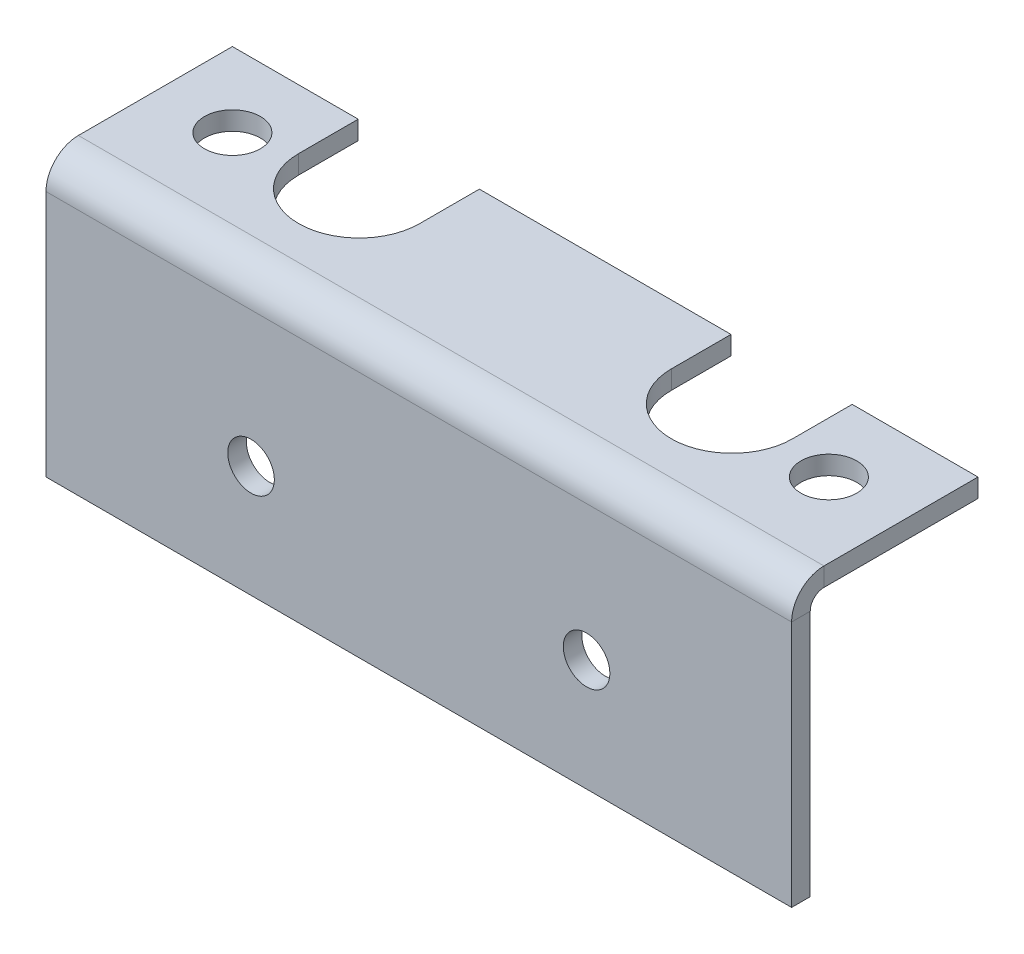
ISO-10303-21;
HEADER;
FILE_DESCRIPTION(('STEP AP214'),'2;1');
FILE_NAME('part.step','',(''),(''),'','','');
FILE_SCHEMA(('AUTOMOTIVE_DESIGN { 1 0 10303 214 1 1 1 1 }'));
ENDSEC;
DATA;
#1=APPLICATION_CONTEXT('core data for automotive mechanical design processes');
#2=APPLICATION_PROTOCOL_DEFINITION('international standard','automotive_design',2000,#1);
#3=PRODUCT_CONTEXT('',#1,'mechanical');
#4=PRODUCT('Part','Part','',(#3));
#5=PRODUCT_RELATED_PRODUCT_CATEGORY('part','',(#4));
#6=PRODUCT_DEFINITION_FORMATION('','',#4);
#7=PRODUCT_DEFINITION_CONTEXT('part definition',#1,'design');
#8=PRODUCT_DEFINITION('design','',#6,#7);
#9=PRODUCT_DEFINITION_SHAPE('','',#8);
#10=(LENGTH_UNIT() NAMED_UNIT(*) SI_UNIT(.MILLI.,.METRE.));
#11=(NAMED_UNIT(*) PLANE_ANGLE_UNIT() SI_UNIT($,.RADIAN.));
#12=(NAMED_UNIT(*) SI_UNIT($,.STERADIAN.) SOLID_ANGLE_UNIT());
#13=UNCERTAINTY_MEASURE_WITH_UNIT(LENGTH_MEASURE(1.E-05),#10,'distance_accuracy_value','');
#14=(GEOMETRIC_REPRESENTATION_CONTEXT(3) GLOBAL_UNCERTAINTY_ASSIGNED_CONTEXT((#13)) GLOBAL_UNIT_ASSIGNED_CONTEXT((#10,
#11,#12)) REPRESENTATION_CONTEXT('',''));
#15=CARTESIAN_POINT('',(0.,0.,0.));
#16=DIRECTION('',(0.,0.,1.));
#17=DIRECTION('',(1.,0.,0.));
#18=AXIS2_PLACEMENT_3D('',#15,#16,#17);
#19=CARTESIAN_POINT('',(0.,7.49999999999999,0.));
#20=DIRECTION('',(0.,-1.,0.));
#21=DIRECTION('',(0.,0.,-1.));
#22=AXIS2_PLACEMENT_3D('',#19,#20,#21);
#23=PLANE('',#22);
#24=CARTESIAN_POINT('',(-16.,7.50000000000008,-6.));
#25=DIRECTION('',(0.,-1.,0.));
#26=DIRECTION('',(0.,0.,-1.));
#27=AXIS2_PLACEMENT_3D('',#24,#25,#26);
#28=CIRCLE('',#27,1.5);
#29=CARTESIAN_POINT('',(-16.,7.50000000000008,-7.5));
#30=VERTEX_POINT('',#29);
#31=EDGE_CURVE('E553',#30,#30,#28,.T.);
#32=ORIENTED_EDGE('',*,*,#31,.T.);
#33=EDGE_LOOP('',(#32));
#34=FACE_BOUND('',#33,.T.);
#35=CARTESIAN_POINT('',(16.,7.50000000000008,-5.99999999999999));
#36=DIRECTION('',(0.,-1.,0.));
#37=DIRECTION('',(0.,0.,-1.));
#38=AXIS2_PLACEMENT_3D('',#35,#36,#37);
#39=CIRCLE('',#38,1.5);
#40=CARTESIAN_POINT('',(16.,7.50000000000008,-7.49999999999999));
#41=VERTEX_POINT('',#40);
#42=EDGE_CURVE('E196',#41,#41,#39,.T.);
#43=ORIENTED_EDGE('',*,*,#42,.T.);
#44=EDGE_LOOP('',(#43));
#45=FACE_BOUND('',#44,.T.);
#46=CARTESIAN_POINT('',(-10.,7.50000000000005,-6.79999999999999));
#47=DIRECTION('',(0.,-1.,0.));
#48=DIRECTION('',(0.,0.,-1.));
#49=AXIS2_PLACEMENT_3D('',#46,#47,#48);
#50=CIRCLE('',#49,3.25);
#51=CARTESIAN_POINT('',(-6.75,7.50000000000005,-6.79999999999999));
#52=VERTEX_POINT('',#51);
#53=CARTESIAN_POINT('',(-13.25,7.50000000000005,-6.79999999999999));
#54=VERTEX_POINT('',#53);
#55=EDGE_CURVE('E180',#52,#54,#50,.T.);
#56=ORIENTED_EDGE('',*,*,#55,.T.);
#57=DIRECTION('',(0.,0.,-1.));
#58=VECTOR('',#57,1.);
#59=CARTESIAN_POINT('',(-13.25,7.50000000000003,0.));
#60=LINE('',#59,#58);
#61=CARTESIAN_POINT('',(-13.25,7.50000000000006,-9.99999999999999));
#62=VERTEX_POINT('',#61);
#63=EDGE_CURVE('E185',#54,#62,#60,.T.);
#64=ORIENTED_EDGE('',*,*,#63,.T.);
#65=DIRECTION('',(-1.,0.,0.));
#66=VECTOR('',#65,1.);
#67=CARTESIAN_POINT('',(0.,7.50000000000003,-9.99999999999999));
#68=LINE('',#67,#66);
#69=CARTESIAN_POINT('',(-20.,7.50000000000003,-9.99999999999999));
#70=VERTEX_POINT('',#69);
#71=EDGE_CURVE('E255',#62,#70,#68,.T.);
#72=ORIENTED_EDGE('',*,*,#71,.T.);
#73=DIRECTION('',(0.,0.,1.));
#74=VECTOR('',#73,1.);
#75=CARTESIAN_POINT('',(-20.,7.49999999999999,0.));
#76=LINE('',#75,#74);
#77=CARTESIAN_POINT('',(-20.,7.5,-1.73659999999999));
#78=VERTEX_POINT('',#77);
#79=EDGE_CURVE('E249',#70,#78,#76,.T.);
#80=ORIENTED_EDGE('',*,*,#79,.T.);
#81=DIRECTION('',(1.,0.,0.));
#82=VECTOR('',#81,1.);
#83=CARTESIAN_POINT('',(-20.,7.5,-1.73659999999999));
#84=LINE('',#83,#82);
#85=CARTESIAN_POINT('',(20.,7.5,-1.7366));
#86=VERTEX_POINT('',#85);
#87=EDGE_CURVE('E268',#86,#78,#84,.F.);
#88=ORIENTED_EDGE('',*,*,#87,.F.);
#89=DIRECTION('',(0.,0.,-1.));
#90=VECTOR('',#89,1.);
#91=CARTESIAN_POINT('',(20.,7.49999999999999,0.));
#92=LINE('',#91,#90);
#93=CARTESIAN_POINT('',(20.,7.50000000000003,-9.99999999999999));
#94=VERTEX_POINT('',#93);
#95=EDGE_CURVE('E256',#86,#94,#92,.T.);
#96=ORIENTED_EDGE('',*,*,#95,.T.);
#97=CARTESIAN_POINT('',(13.25,7.50000000000006,-9.99999999999999));
#98=VERTEX_POINT('',#97);
#99=EDGE_CURVE('E252',#94,#98,#68,.T.);
#100=ORIENTED_EDGE('',*,*,#99,.T.);
#101=DIRECTION('',(0.,0.,-1.));
#102=VECTOR('',#101,1.);
#103=CARTESIAN_POINT('',(13.25,7.50000000000003,0.));
#104=LINE('',#103,#102);
#105=CARTESIAN_POINT('',(13.25,7.50000000000005,-6.8));
#106=VERTEX_POINT('',#105);
#107=EDGE_CURVE('E214',#106,#98,#104,.T.);
#108=ORIENTED_EDGE('',*,*,#107,.F.);
#109=CARTESIAN_POINT('',(10.,7.50000000000005,-6.8));
#110=DIRECTION('',(0.,-1.,0.));
#111=DIRECTION('',(0.,0.,-1.));
#112=AXIS2_PLACEMENT_3D('',#109,#110,#111);
#113=CIRCLE('',#112,3.25);
#114=CARTESIAN_POINT('',(6.75,7.50000000000005,-6.8));
#115=VERTEX_POINT('',#114);
#116=EDGE_CURVE('E209',#115,#106,#113,.F.);
#117=ORIENTED_EDGE('',*,*,#116,.F.);
#118=DIRECTION('',(0.,0.,1.));
#119=VECTOR('',#118,1.);
#120=CARTESIAN_POINT('',(6.75,7.50000000000003,0.));
#121=LINE('',#120,#119);
#122=CARTESIAN_POINT('',(6.74999999999999,7.50000000000006,-9.99999999999999));
#123=VERTEX_POINT('',#122);
#124=EDGE_CURVE('E211',#123,#115,#121,.T.);
#125=ORIENTED_EDGE('',*,*,#124,.F.);
#126=CARTESIAN_POINT('',(-6.75,7.50000000000003,-9.99999999999999));
#127=VERTEX_POINT('',#126);
#128=EDGE_CURVE('E190',#123,#127,#68,.T.);
#129=ORIENTED_EDGE('',*,*,#128,.T.);
#130=DIRECTION('',(0.,0.,1.));
#131=VECTOR('',#130,1.);
#132=CARTESIAN_POINT('',(-6.75,7.50000000000003,0.));
#133=LINE('',#132,#131);
#134=EDGE_CURVE('E73',#127,#52,#133,.T.);
#135=ORIENTED_EDGE('',*,*,#134,.T.);
#136=EDGE_LOOP('',(#56,#64,#72,#80,#88,#96,#100,#108,#117,#125,#129,#135));
#137=FACE_BOUND('',#136,.T.);
#138=ADVANCED_FACE('F58',(#34,#45,#137),#23,.F.);
#139=CARTESIAN_POINT('',(0.,6.49999999999999,0.));
#140=DIRECTION('',(0.,-1.,0.));
#141=DIRECTION('',(0.,0.,-1.));
#142=AXIS2_PLACEMENT_3D('',#139,#140,#141);
#143=PLANE('',#142);
#144=CARTESIAN_POINT('',(-16.,6.50000000000001,-6.));
#145=DIRECTION('',(0.,-1.,0.));
#146=DIRECTION('',(0.,0.,-1.));
#147=AXIS2_PLACEMENT_3D('',#144,#145,#146);
#148=CIRCLE('',#147,1.5);
#149=CARTESIAN_POINT('',(-16.,6.50000000000001,-7.5));
#150=VERTEX_POINT('',#149);
#151=EDGE_CURVE('E556',#150,#150,#148,.T.);
#152=ORIENTED_EDGE('',*,*,#151,.F.);
#153=EDGE_LOOP('',(#152));
#154=FACE_BOUND('',#153,.T.);
#155=CARTESIAN_POINT('',(16.,6.50000000000001,-5.99999999999999));
#156=DIRECTION('',(0.,-1.,0.));
#157=DIRECTION('',(0.,0.,-1.));
#158=AXIS2_PLACEMENT_3D('',#155,#156,#157);
#159=CIRCLE('',#158,1.5);
#160=CARTESIAN_POINT('',(16.,6.50000000000001,-7.49999999999999));
#161=VERTEX_POINT('',#160);
#162=EDGE_CURVE('E558',#161,#161,#159,.T.);
#163=ORIENTED_EDGE('',*,*,#162,.F.);
#164=EDGE_LOOP('',(#163));
#165=FACE_BOUND('',#164,.T.);
#166=DIRECTION('',(0.,0.,-1.));
#167=VECTOR('',#166,1.);
#168=CARTESIAN_POINT('',(-13.25,6.49999999999999,0.));
#169=LINE('',#168,#167);
#170=CARTESIAN_POINT('',(-13.25,6.50000000000002,-6.8));
#171=VERTEX_POINT('',#170);
#172=CARTESIAN_POINT('',(-13.25,6.50000000000003,-10.));
#173=VERTEX_POINT('',#172);
#174=EDGE_CURVE('E191',#171,#173,#169,.T.);
#175=ORIENTED_EDGE('',*,*,#174,.F.);
#176=CARTESIAN_POINT('',(-10.,6.50000000000002,-6.8));
#177=DIRECTION('',(0.,-1.,0.));
#178=DIRECTION('',(0.,0.,-1.));
#179=AXIS2_PLACEMENT_3D('',#176,#177,#178);
#180=CIRCLE('',#179,3.25);
#181=CARTESIAN_POINT('',(-6.75,6.50000000000002,-6.8));
#182=VERTEX_POINT('',#181);
#183=EDGE_CURVE('E193',#182,#171,#180,.T.);
#184=ORIENTED_EDGE('',*,*,#183,.F.);
#185=DIRECTION('',(0.,0.,1.));
#186=VECTOR('',#185,1.);
#187=CARTESIAN_POINT('',(-6.75,6.49999999999999,0.));
#188=LINE('',#187,#186);
#189=CARTESIAN_POINT('',(-6.75,6.50000000000003,-10.));
#190=VERTEX_POINT('',#189);
#191=EDGE_CURVE('E172',#190,#182,#188,.T.);
#192=ORIENTED_EDGE('',*,*,#191,.F.);
#193=DIRECTION('',(1.,0.,0.));
#194=VECTOR('',#193,1.);
#195=CARTESIAN_POINT('',(-20.,6.50000000000003,-10.));
#196=LINE('',#195,#194);
#197=CARTESIAN_POINT('',(6.75,6.50000000000003,-10.));
#198=VERTEX_POINT('',#197);
#199=EDGE_CURVE('E264',#198,#190,#196,.F.);
#200=ORIENTED_EDGE('',*,*,#199,.F.);
#201=DIRECTION('',(0.,0.,1.));
#202=VECTOR('',#201,1.);
#203=CARTESIAN_POINT('',(6.75,6.49999999999999,0.));
#204=LINE('',#203,#202);
#205=CARTESIAN_POINT('',(6.75,6.50000000000002,-6.8));
#206=VERTEX_POINT('',#205);
#207=EDGE_CURVE('E81',#198,#206,#204,.T.);
#208=ORIENTED_EDGE('',*,*,#207,.T.);
#209=CARTESIAN_POINT('',(10.,6.50000000000002,-6.8));
#210=DIRECTION('',(0.,-1.,0.));
#211=DIRECTION('',(0.,0.,-1.));
#212=AXIS2_PLACEMENT_3D('',#209,#210,#211);
#213=CIRCLE('',#212,3.25);
#214=CARTESIAN_POINT('',(13.25,6.50000000000002,-6.80000000000001));
#215=VERTEX_POINT('',#214);
#216=EDGE_CURVE('E217',#206,#215,#213,.F.);
#217=ORIENTED_EDGE('',*,*,#216,.T.);
#218=DIRECTION('',(0.,0.,-1.));
#219=VECTOR('',#218,1.);
#220=CARTESIAN_POINT('',(13.25,6.49999999999999,0.));
#221=LINE('',#220,#219);
#222=CARTESIAN_POINT('',(13.25,6.50000000000003,-10.));
#223=VERTEX_POINT('',#222);
#224=EDGE_CURVE('E212',#215,#223,#221,.T.);
#225=ORIENTED_EDGE('',*,*,#224,.T.);
#226=CARTESIAN_POINT('',(20.,6.50000000000003,-10.));
#227=VERTEX_POINT('',#226);
#228=EDGE_CURVE('E261',#227,#223,#196,.F.);
#229=ORIENTED_EDGE('',*,*,#228,.F.);
#230=DIRECTION('',(0.,0.,1.));
#231=VECTOR('',#230,1.);
#232=CARTESIAN_POINT('',(20.,6.50000000000003,-10.));
#233=LINE('',#232,#231);
#234=CARTESIAN_POINT('',(20.,6.5,-1.7366));
#235=VERTEX_POINT('',#234);
#236=EDGE_CURVE('E266',#235,#227,#233,.F.);
#237=ORIENTED_EDGE('',*,*,#236,.F.);
#238=DIRECTION('',(1.,0.,0.));
#239=VECTOR('',#238,1.);
#240=CARTESIAN_POINT('',(-20.,6.5,-1.7366));
#241=LINE('',#240,#239);
#242=CARTESIAN_POINT('',(-20.,6.5,-1.7366));
#243=VERTEX_POINT('',#242);
#244=EDGE_CURVE('E273',#243,#235,#241,.T.);
#245=ORIENTED_EDGE('',*,*,#244,.F.);
#246=DIRECTION('',(0.,0.,-1.));
#247=VECTOR('',#246,1.);
#248=CARTESIAN_POINT('',(-20.,6.5,-1.));
#249=LINE('',#248,#247);
#250=CARTESIAN_POINT('',(-20.,6.50000000000003,-10.));
#251=VERTEX_POINT('',#250);
#252=EDGE_CURVE('E258',#251,#243,#249,.F.);
#253=ORIENTED_EDGE('',*,*,#252,.F.);
#254=EDGE_CURVE('E265',#173,#251,#196,.F.);
#255=ORIENTED_EDGE('',*,*,#254,.F.);
#256=EDGE_LOOP('',(#175,#184,#192,#200,#208,#217,#225,#229,#237,#245,#253,#255));
#257=FACE_BOUND('',#256,.T.);
#258=ADVANCED_FACE('F339',(#154,#165,#257),#143,.T.);
#259=CARTESIAN_POINT('',(-20.,7.50000000000003,-9.99999999999999));
#260=DIRECTION('',(0.,0.,1.));
#261=DIRECTION('',(0.,-1.,0.));
#262=AXIS2_PLACEMENT_3D('',#259,#260,#261);
#263=PLANE('',#262);
#264=ORIENTED_EDGE('',*,*,#71,.F.);
#265=DIRECTION('',(0.,-1.,0.));
#266=VECTOR('',#265,1.);
#267=CARTESIAN_POINT('',(-13.25,7.50000000000006,-9.99999999999999));
#268=LINE('',#267,#266);
#269=EDGE_CURVE('E203',#62,#173,#268,.T.);
#270=ORIENTED_EDGE('',*,*,#269,.T.);
#271=ORIENTED_EDGE('',*,*,#254,.T.);
#272=DIRECTION('',(0.,-1.,0.));
#273=VECTOR('',#272,1.);
#274=CARTESIAN_POINT('',(-20.,7.50000000000003,-9.99999999999999));
#275=LINE('',#274,#273);
#276=EDGE_CURVE('E246',#70,#251,#275,.T.);
#277=ORIENTED_EDGE('',*,*,#276,.F.);
#278=EDGE_LOOP('',(#264,#270,#271,#277));
#279=FACE_BOUND('',#278,.T.);
#280=ADVANCED_FACE('F348',(#279),#263,.F.);
#281=DIRECTION('',(0.,-1.,0.));
#282=VECTOR('',#281,1.);
#283=CARTESIAN_POINT('',(13.25,7.50000000000006,-9.99999999999999));
#284=LINE('',#283,#282);
#285=EDGE_CURVE('E225',#98,#223,#284,.T.);
#286=ORIENTED_EDGE('',*,*,#285,.F.);
#287=ORIENTED_EDGE('',*,*,#99,.F.);
#288=DIRECTION('',(0.,-1.,0.));
#289=VECTOR('',#288,1.);
#290=CARTESIAN_POINT('',(20.,7.50000000000003,-9.99999999999999));
#291=LINE('',#290,#289);
#292=EDGE_CURVE('E242',#94,#227,#291,.T.);
#293=ORIENTED_EDGE('',*,*,#292,.T.);
#294=ORIENTED_EDGE('',*,*,#228,.T.);
#295=EDGE_LOOP('',(#286,#287,#293,#294));
#296=FACE_BOUND('',#295,.T.);
#297=ADVANCED_FACE('F365',(#296),#263,.F.);
#298=ORIENTED_EDGE('',*,*,#199,.T.);
#299=DIRECTION('',(0.,-1.,0.));
#300=VECTOR('',#299,1.);
#301=CARTESIAN_POINT('',(-6.75,7.50000000000006,-9.99999999999999));
#302=LINE('',#301,#300);
#303=EDGE_CURVE('E177',#127,#190,#302,.T.);
#304=ORIENTED_EDGE('',*,*,#303,.F.);
#305=ORIENTED_EDGE('',*,*,#128,.F.);
#306=DIRECTION('',(0.,-1.,0.));
#307=VECTOR('',#306,1.);
#308=CARTESIAN_POINT('',(6.74999999999999,7.50000000000006,-9.99999999999999));
#309=LINE('',#308,#307);
#310=EDGE_CURVE('E227',#123,#198,#309,.T.);
#311=ORIENTED_EDGE('',*,*,#310,.T.);
#312=EDGE_LOOP('',(#298,#304,#305,#311));
#313=FACE_BOUND('',#312,.T.);
#314=ADVANCED_FACE('F352',(#313),#263,.F.);
#315=CARTESIAN_POINT('',(20.,-7.5,-1.));
#316=DIRECTION('',(1.,0.,0.));
#317=DIRECTION('',(0.,0.,-1.));
#318=AXIS2_PLACEMENT_3D('',#315,#316,#317);
#319=PLANE('',#318);
#320=DIRECTION('',(0.,1.,0.));
#321=VECTOR('',#320,1.);
#322=CARTESIAN_POINT('',(20.,-7.5,-1.));
#323=LINE('',#322,#321);
#324=CARTESIAN_POINT('',(20.,-7.5,-1.));
#325=VERTEX_POINT('',#324);
#326=CARTESIAN_POINT('',(20.,5.7634,-1.));
#327=VERTEX_POINT('',#326);
#328=EDGE_CURVE('E299',#325,#327,#323,.T.);
#329=ORIENTED_EDGE('',*,*,#328,.T.);
#330=DIRECTION('',(0.,0.,1.));
#331=VECTOR('',#330,1.);
#332=CARTESIAN_POINT('',(20.,5.7634,-1.));
#333=LINE('',#332,#331);
#334=CARTESIAN_POINT('',(20.,5.7634,0.));
#335=VERTEX_POINT('',#334);
#336=EDGE_CURVE('E283',#327,#335,#333,.T.);
#337=ORIENTED_EDGE('',*,*,#336,.T.);
#338=DIRECTION('',(0.,1.,0.));
#339=VECTOR('',#338,1.);
#340=CARTESIAN_POINT('',(20.,-7.5,0.));
#341=LINE('',#340,#339);
#342=CARTESIAN_POINT('',(20.,-7.5,0.));
#343=VERTEX_POINT('',#342);
#344=EDGE_CURVE('E297',#343,#335,#341,.T.);
#345=ORIENTED_EDGE('',*,*,#344,.F.);
#346=DIRECTION('',(0.,0.,1.));
#347=VECTOR('',#346,1.);
#348=CARTESIAN_POINT('',(20.,-7.5,-1.));
#349=LINE('',#348,#347);
#350=EDGE_CURVE('E13',#325,#343,#349,.T.);
#351=ORIENTED_EDGE('',*,*,#350,.F.);
#352=EDGE_LOOP('',(#329,#337,#345,#351));
#353=FACE_BOUND('',#352,.T.);
#354=ADVANCED_FACE('F60',(#353),#319,.T.);
#355=CARTESIAN_POINT('',(0.,0.,-1.));
#356=DIRECTION('',(0.,0.,-1.));
#357=DIRECTION('',(-1.,0.,0.));
#358=AXIS2_PLACEMENT_3D('',#355,#356,#357);
#359=PLANE('',#358);
#360=CARTESIAN_POINT('',(-9.,-1.5,-1.));
#361=DIRECTION('',(0.,0.,-1.));
#362=DIRECTION('',(-1.,0.,0.));
#363=AXIS2_PLACEMENT_3D('',#360,#361,#362);
#364=CIRCLE('',#363,1.24999999999999);
#365=CARTESIAN_POINT('',(-10.25,-1.5,-1.));
#366=VERTEX_POINT('',#365);
#367=EDGE_CURVE('E232',#366,#366,#364,.T.);
#368=ORIENTED_EDGE('',*,*,#367,.F.);
#369=EDGE_LOOP('',(#368));
#370=FACE_BOUND('',#369,.T.);
#371=CARTESIAN_POINT('',(9.,-1.5,-1.));
#372=DIRECTION('',(0.,0.,-1.));
#373=DIRECTION('',(-1.,0.,0.));
#374=AXIS2_PLACEMENT_3D('',#371,#372,#373);
#375=CIRCLE('',#374,1.24999999999999);
#376=CARTESIAN_POINT('',(7.75000000000001,-1.5,-1.));
#377=VERTEX_POINT('',#376);
#378=EDGE_CURVE('E238',#377,#377,#375,.T.);
#379=ORIENTED_EDGE('',*,*,#378,.F.);
#380=EDGE_LOOP('',(#379));
#381=FACE_BOUND('',#380,.T.);
#382=DIRECTION('',(0.,-1.,0.));
#383=VECTOR('',#382,1.);
#384=CARTESIAN_POINT('',(-20.,-7.5,-1.));
#385=LINE('',#384,#383);
#386=CARTESIAN_POINT('',(-20.,5.7634,-1.));
#387=VERTEX_POINT('',#386);
#388=CARTESIAN_POINT('',(-20.,-7.5,-1.));
#389=VERTEX_POINT('',#388);
#390=EDGE_CURVE('E302',#387,#389,#385,.T.);
#391=ORIENTED_EDGE('',*,*,#390,.F.);
#392=DIRECTION('',(1.,0.,0.));
#393=VECTOR('',#392,1.);
#394=CARTESIAN_POINT('',(20.,5.7634,-1.));
#395=LINE('',#394,#393);
#396=EDGE_CURVE('E289',#327,#387,#395,.F.);
#397=ORIENTED_EDGE('',*,*,#396,.F.);
#398=ORIENTED_EDGE('',*,*,#328,.F.);
#399=DIRECTION('',(1.,0.,0.));
#400=VECTOR('',#399,1.);
#401=CARTESIAN_POINT('',(-20.,-7.5,-1.));
#402=LINE('',#401,#400);
#403=EDGE_CURVE('E305',#389,#325,#402,.T.);
#404=ORIENTED_EDGE('',*,*,#403,.F.);
#405=EDGE_LOOP('',(#391,#397,#398,#404));
#406=FACE_BOUND('',#405,.T.);
#407=ADVANCED_FACE('F417',(#370,#381,#406),#359,.T.);
#408=CARTESIAN_POINT('',(0.,0.,0.));
#409=DIRECTION('',(0.,0.,-1.));
#410=DIRECTION('',(-1.,0.,0.));
#411=AXIS2_PLACEMENT_3D('',#408,#409,#410);
#412=PLANE('',#411);
#413=CARTESIAN_POINT('',(-9.,-1.5,0.));
#414=DIRECTION('',(0.,0.,1.));
#415=DIRECTION('',(1.,0.,0.));
#416=AXIS2_PLACEMENT_3D('',#413,#414,#415);
#417=CIRCLE('',#416,1.24999999999999);
#418=CARTESIAN_POINT('',(-7.75000000000001,-1.5,0.));
#419=VERTEX_POINT('',#418);
#420=EDGE_CURVE('E206',#419,#419,#417,.T.);
#421=ORIENTED_EDGE('',*,*,#420,.F.);
#422=EDGE_LOOP('',(#421));
#423=FACE_BOUND('',#422,.T.);
#424=CARTESIAN_POINT('',(9.,-1.5,0.));
#425=DIRECTION('',(0.,0.,1.));
#426=DIRECTION('',(1.,0.,0.));
#427=AXIS2_PLACEMENT_3D('',#424,#425,#426);
#428=CIRCLE('',#427,1.24999999999999);
#429=CARTESIAN_POINT('',(10.25,-1.5,0.));
#430=VERTEX_POINT('',#429);
#431=EDGE_CURVE('E235',#430,#430,#428,.T.);
#432=ORIENTED_EDGE('',*,*,#431,.F.);
#433=EDGE_LOOP('',(#432));
#434=FACE_BOUND('',#433,.T.);
#435=DIRECTION('',(1.,0.,0.));
#436=VECTOR('',#435,1.);
#437=CARTESIAN_POINT('',(20.,5.7634,0.));
#438=LINE('',#437,#436);
#439=CARTESIAN_POINT('',(-20.,5.7634,0.));
#440=VERTEX_POINT('',#439);
#441=EDGE_CURVE('E277',#335,#440,#438,.F.);
#442=ORIENTED_EDGE('',*,*,#441,.T.);
#443=DIRECTION('',(0.,-1.,0.));
#444=VECTOR('',#443,1.);
#445=CARTESIAN_POINT('',(-20.,-7.5,0.));
#446=LINE('',#445,#444);
#447=CARTESIAN_POINT('',(-20.,-7.5,0.));
#448=VERTEX_POINT('',#447);
#449=EDGE_CURVE('E310',#440,#448,#446,.T.);
#450=ORIENTED_EDGE('',*,*,#449,.T.);
#451=DIRECTION('',(1.,0.,0.));
#452=VECTOR('',#451,1.);
#453=CARTESIAN_POINT('',(-20.,-7.5,0.));
#454=LINE('',#453,#452);
#455=EDGE_CURVE('E303',#448,#343,#454,.T.);
#456=ORIENTED_EDGE('',*,*,#455,.T.);
#457=ORIENTED_EDGE('',*,*,#344,.T.);
#458=EDGE_LOOP('',(#442,#450,#456,#457));
#459=FACE_BOUND('',#458,.T.);
#460=ADVANCED_FACE('F315',(#423,#434,#459),#412,.F.);
#461=CARTESIAN_POINT('',(-20.,-7.5,-1.));
#462=DIRECTION('',(0.,-1.,0.));
#463=DIRECTION('',(0.,0.,-1.));
#464=AXIS2_PLACEMENT_3D('',#461,#462,#463);
#465=PLANE('',#464);
#466=ORIENTED_EDGE('',*,*,#455,.F.);
#467=DIRECTION('',(0.,0.,1.));
#468=VECTOR('',#467,1.);
#469=CARTESIAN_POINT('',(-20.,-7.5,-1.));
#470=LINE('',#469,#468);
#471=EDGE_CURVE('E62',#389,#448,#470,.T.);
#472=ORIENTED_EDGE('',*,*,#471,.F.);
#473=ORIENTED_EDGE('',*,*,#403,.T.);
#474=ORIENTED_EDGE('',*,*,#350,.T.);
#475=EDGE_LOOP('',(#466,#472,#473,#474));
#476=FACE_BOUND('',#475,.T.);
#477=ADVANCED_FACE('F322',(#476),#465,.T.);
#478=CARTESIAN_POINT('',(-20.,-7.5,-1.));
#479=DIRECTION('',(-1.,0.,0.));
#480=DIRECTION('',(0.,0.,1.));
#481=AXIS2_PLACEMENT_3D('',#478,#479,#480);
#482=PLANE('',#481);
#483=DIRECTION('',(0.,0.,1.));
#484=VECTOR('',#483,1.);
#485=CARTESIAN_POINT('',(-20.,5.7634,-0.999999999999999));
#486=LINE('',#485,#484);
#487=EDGE_CURVE('E294',#387,#440,#486,.T.);
#488=ORIENTED_EDGE('',*,*,#487,.F.);
#489=ORIENTED_EDGE('',*,*,#390,.T.);
#490=ORIENTED_EDGE('',*,*,#471,.T.);
#491=ORIENTED_EDGE('',*,*,#449,.F.);
#492=EDGE_LOOP('',(#488,#489,#490,#491));
#493=FACE_BOUND('',#492,.T.);
#494=ADVANCED_FACE('F413',(#493),#482,.T.);
#495=CARTESIAN_POINT('',(-20.,5.7634,-1.7366));
#496=DIRECTION('',(-1.,0.,0.));
#497=DIRECTION('',(0.,0.,1.));
#498=AXIS2_PLACEMENT_3D('',#495,#496,#497);
#499=PLANE('',#498);
#500=DIRECTION('',(0.,-1.,0.));
#501=VECTOR('',#500,1.);
#502=CARTESIAN_POINT('',(-20.,7.5,-1.73659999999999));
#503=LINE('',#502,#501);
#504=EDGE_CURVE('E241',#243,#78,#503,.F.);
#505=ORIENTED_EDGE('',*,*,#504,.F.);
#506=CARTESIAN_POINT('',(-20.,5.7634,-1.7366));
#507=DIRECTION('',(1.,0.,0.));
#508=DIRECTION('',(0.,0.,-1.));
#509=AXIS2_PLACEMENT_3D('',#506,#507,#508);
#510=CIRCLE('',#509,0.7366);
#511=EDGE_CURVE('E286',#387,#243,#510,.F.);
#512=ORIENTED_EDGE('',*,*,#511,.F.);
#513=ORIENTED_EDGE('',*,*,#487,.T.);
#514=CARTESIAN_POINT('',(-20.,5.7634,-1.7366));
#515=DIRECTION('',(1.,0.,0.));
#516=DIRECTION('',(0.,0.,-1.));
#517=AXIS2_PLACEMENT_3D('',#514,#515,#516);
#518=CIRCLE('',#517,1.7366);
#519=EDGE_CURVE('E279',#440,#78,#518,.F.);
#520=ORIENTED_EDGE('',*,*,#519,.T.);
#521=EDGE_LOOP('',(#505,#512,#513,#520));
#522=FACE_BOUND('',#521,.T.);
#523=ADVANCED_FACE('F410',(#522),#499,.T.);
#524=CARTESIAN_POINT('',(20.,5.7634,-1.7366));
#525=DIRECTION('',(-1.,0.,0.));
#526=DIRECTION('',(0.,0.,1.));
#527=AXIS2_PLACEMENT_3D('',#524,#525,#526);
#528=PLANE('',#527);
#529=CARTESIAN_POINT('',(20.,5.7634,-1.7366));
#530=DIRECTION('',(1.,0.,0.));
#531=DIRECTION('',(0.,0.,-1.));
#532=AXIS2_PLACEMENT_3D('',#529,#530,#531);
#533=CIRCLE('',#532,0.7366);
#534=EDGE_CURVE('E245',#235,#327,#533,.T.);
#535=ORIENTED_EDGE('',*,*,#534,.F.);
#536=DIRECTION('',(0.,-1.,0.));
#537=VECTOR('',#536,1.);
#538=CARTESIAN_POINT('',(20.,6.5,-1.7366));
#539=LINE('',#538,#537);
#540=EDGE_CURVE('E270',#235,#86,#539,.F.);
#541=ORIENTED_EDGE('',*,*,#540,.T.);
#542=CARTESIAN_POINT('',(20.,5.7634,-1.7366));
#543=DIRECTION('',(1.,0.,0.));
#544=DIRECTION('',(0.,0.,-1.));
#545=AXIS2_PLACEMENT_3D('',#542,#543,#544);
#546=CIRCLE('',#545,1.7366);
#547=EDGE_CURVE('E280',#86,#335,#546,.T.);
#548=ORIENTED_EDGE('',*,*,#547,.T.);
#549=ORIENTED_EDGE('',*,*,#336,.F.);
#550=EDGE_LOOP('',(#535,#541,#548,#549));
#551=FACE_BOUND('',#550,.T.);
#552=ADVANCED_FACE('F329',(#551),#528,.F.);
#553=CARTESIAN_POINT('',(20.,5.7634,-1.7366));
#554=DIRECTION('',(1.,0.,0.));
#555=DIRECTION('',(0.,1.,0.));
#556=AXIS2_PLACEMENT_3D('',#553,#554,#555);
#557=CYLINDRICAL_SURFACE('',#556,1.7366);
#558=ORIENTED_EDGE('',*,*,#441,.F.);
#559=ORIENTED_EDGE('',*,*,#547,.F.);
#560=ORIENTED_EDGE('',*,*,#87,.T.);
#561=ORIENTED_EDGE('',*,*,#519,.F.);
#562=EDGE_LOOP('',(#558,#559,#560,#561));
#563=FACE_BOUND('',#562,.T.);
#564=ADVANCED_FACE('F405',(#563),#557,.T.);
#565=CARTESIAN_POINT('',(20.,5.7634,-1.7366));
#566=DIRECTION('',(1.,0.,0.));
#567=DIRECTION('',(0.,1.,0.));
#568=AXIS2_PLACEMENT_3D('',#565,#566,#567);
#569=CYLINDRICAL_SURFACE('',#568,0.7366);
#570=ORIENTED_EDGE('',*,*,#396,.T.);
#571=ORIENTED_EDGE('',*,*,#511,.T.);
#572=ORIENTED_EDGE('',*,*,#244,.T.);
#573=ORIENTED_EDGE('',*,*,#534,.T.);
#574=EDGE_LOOP('',(#570,#571,#572,#573));
#575=FACE_BOUND('',#574,.T.);
#576=ADVANCED_FACE('F332',(#575),#569,.F.);
#577=CARTESIAN_POINT('',(20.,7.50000000000003,-9.99999999999999));
#578=DIRECTION('',(-1.,0.,0.));
#579=DIRECTION('',(0.,0.,1.));
#580=AXIS2_PLACEMENT_3D('',#577,#578,#579);
#581=PLANE('',#580);
#582=ORIENTED_EDGE('',*,*,#540,.F.);
#583=ORIENTED_EDGE('',*,*,#236,.T.);
#584=ORIENTED_EDGE('',*,*,#292,.F.);
#585=ORIENTED_EDGE('',*,*,#95,.F.);
#586=EDGE_LOOP('',(#582,#583,#584,#585));
#587=FACE_BOUND('',#586,.T.);
#588=ADVANCED_FACE('F362',(#587),#581,.F.);
#589=CARTESIAN_POINT('',(-20.,7.5,-0.999999999999997));
#590=DIRECTION('',(1.,0.,0.));
#591=DIRECTION('',(0.,0.,-1.));
#592=AXIS2_PLACEMENT_3D('',#589,#590,#591);
#593=PLANE('',#592);
#594=ORIENTED_EDGE('',*,*,#504,.T.);
#595=ORIENTED_EDGE('',*,*,#79,.F.);
#596=ORIENTED_EDGE('',*,*,#276,.T.);
#597=ORIENTED_EDGE('',*,*,#252,.T.);
#598=EDGE_LOOP('',(#594,#595,#596,#597));
#599=FACE_BOUND('',#598,.T.);
#600=ADVANCED_FACE('F343',(#599),#593,.F.);
#601=CARTESIAN_POINT('',(9.,-1.5,0.));
#602=DIRECTION('',(0.,0.,1.));
#603=DIRECTION('',(1.,0.,0.));
#604=AXIS2_PLACEMENT_3D('',#601,#602,#603);
#605=CYLINDRICAL_SURFACE('',#604,1.24999999999999);
#606=ORIENTED_EDGE('',*,*,#378,.T.);
#607=EDGE_LOOP('',(#606));
#608=FACE_BOUND('',#607,.T.);
#609=ORIENTED_EDGE('',*,*,#431,.T.);
#610=EDGE_LOOP('',(#609));
#611=FACE_BOUND('',#610,.T.);
#612=ADVANCED_FACE('F396',(#608,#611),#605,.F.);
#613=CARTESIAN_POINT('',(-9.,-1.5,0.));
#614=DIRECTION('',(0.,0.,1.));
#615=DIRECTION('',(1.,0.,0.));
#616=AXIS2_PLACEMENT_3D('',#613,#614,#615);
#617=CYLINDRICAL_SURFACE('',#616,1.24999999999999);
#618=ORIENTED_EDGE('',*,*,#367,.T.);
#619=EDGE_LOOP('',(#618));
#620=FACE_BOUND('',#619,.T.);
#621=ORIENTED_EDGE('',*,*,#420,.T.);
#622=EDGE_LOOP('',(#621));
#623=FACE_BOUND('',#622,.T.);
#624=ADVANCED_FACE('F465',(#620,#623),#617,.F.);
#625=CARTESIAN_POINT('',(10.,7.50000000000005,-6.8));
#626=DIRECTION('',(0.,-1.,0.));
#627=DIRECTION('',(0.,0.,-1.));
#628=AXIS2_PLACEMENT_3D('',#625,#626,#627);
#629=CYLINDRICAL_SURFACE('',#628,3.25);
#630=ORIENTED_EDGE('',*,*,#216,.F.);
#631=DIRECTION('',(0.,-1.,0.));
#632=VECTOR('',#631,1.);
#633=CARTESIAN_POINT('',(6.75,7.50000000000005,-6.8));
#634=LINE('',#633,#632);
#635=EDGE_CURVE('E216',#115,#206,#634,.T.);
#636=ORIENTED_EDGE('',*,*,#635,.F.);
#637=ORIENTED_EDGE('',*,*,#116,.T.);
#638=DIRECTION('',(0.,-1.,0.));
#639=VECTOR('',#638,1.);
#640=CARTESIAN_POINT('',(13.25,7.50000000000005,-6.8));
#641=LINE('',#640,#639);
#642=EDGE_CURVE('E201',#106,#215,#641,.T.);
#643=ORIENTED_EDGE('',*,*,#642,.T.);
#644=EDGE_LOOP('',(#630,#636,#637,#643));
#645=FACE_BOUND('',#644,.T.);
#646=ADVANCED_FACE('F373',(#645),#629,.F.);
#647=CARTESIAN_POINT('',(13.25,7.50000000000003,0.));
#648=DIRECTION('',(-1.,0.,0.));
#649=DIRECTION('',(0.,0.,1.));
#650=AXIS2_PLACEMENT_3D('',#647,#648,#649);
#651=PLANE('',#650);
#652=ORIENTED_EDGE('',*,*,#224,.F.);
#653=ORIENTED_EDGE('',*,*,#642,.F.);
#654=ORIENTED_EDGE('',*,*,#107,.T.);
#655=ORIENTED_EDGE('',*,*,#285,.T.);
#656=EDGE_LOOP('',(#652,#653,#654,#655));
#657=FACE_BOUND('',#656,.T.);
#658=ADVANCED_FACE('F370',(#657),#651,.T.);
#659=CARTESIAN_POINT('',(6.75,7.50000000000003,0.));
#660=DIRECTION('',(1.,0.,0.));
#661=DIRECTION('',(0.,0.,-1.));
#662=AXIS2_PLACEMENT_3D('',#659,#660,#661);
#663=PLANE('',#662);
#664=ORIENTED_EDGE('',*,*,#207,.F.);
#665=ORIENTED_EDGE('',*,*,#310,.F.);
#666=ORIENTED_EDGE('',*,*,#124,.T.);
#667=ORIENTED_EDGE('',*,*,#635,.T.);
#668=EDGE_LOOP('',(#664,#665,#666,#667));
#669=FACE_BOUND('',#668,.T.);
#670=ADVANCED_FACE('F375',(#669),#663,.T.);
#671=CARTESIAN_POINT('',(-13.25,7.50000000000003,0.));
#672=DIRECTION('',(-1.,0.,0.));
#673=DIRECTION('',(0.,0.,1.));
#674=AXIS2_PLACEMENT_3D('',#671,#672,#673);
#675=PLANE('',#674);
#676=ORIENTED_EDGE('',*,*,#174,.T.);
#677=ORIENTED_EDGE('',*,*,#269,.F.);
#678=ORIENTED_EDGE('',*,*,#63,.F.);
#679=DIRECTION('',(0.,-1.,0.));
#680=VECTOR('',#679,1.);
#681=CARTESIAN_POINT('',(-13.25,7.50000000000005,-6.79999999999999));
#682=LINE('',#681,#680);
#683=EDGE_CURVE('E176',#54,#171,#682,.T.);
#684=ORIENTED_EDGE('',*,*,#683,.T.);
#685=EDGE_LOOP('',(#676,#677,#678,#684));
#686=FACE_BOUND('',#685,.T.);
#687=ADVANCED_FACE('F354',(#686),#675,.F.);
#688=CARTESIAN_POINT('',(-10.,7.50000000000005,-6.79999999999999));
#689=DIRECTION('',(0.,-1.,0.));
#690=DIRECTION('',(0.,0.,-1.));
#691=AXIS2_PLACEMENT_3D('',#688,#689,#690);
#692=CYLINDRICAL_SURFACE('',#691,3.25);
#693=ORIENTED_EDGE('',*,*,#183,.T.);
#694=ORIENTED_EDGE('',*,*,#683,.F.);
#695=ORIENTED_EDGE('',*,*,#55,.F.);
#696=DIRECTION('',(0.,-1.,0.));
#697=VECTOR('',#696,1.);
#698=CARTESIAN_POINT('',(-6.75,7.50000000000005,-6.79999999999999));
#699=LINE('',#698,#697);
#700=EDGE_CURVE('E168',#52,#182,#699,.T.);
#701=ORIENTED_EDGE('',*,*,#700,.T.);
#702=EDGE_LOOP('',(#693,#694,#695,#701));
#703=FACE_BOUND('',#702,.T.);
#704=ADVANCED_FACE('F181',(#703),#692,.F.);
#705=CARTESIAN_POINT('',(-6.75,7.50000000000003,0.));
#706=DIRECTION('',(1.,0.,0.));
#707=DIRECTION('',(0.,0.,-1.));
#708=AXIS2_PLACEMENT_3D('',#705,#706,#707);
#709=PLANE('',#708);
#710=ORIENTED_EDGE('',*,*,#191,.T.);
#711=ORIENTED_EDGE('',*,*,#700,.F.);
#712=ORIENTED_EDGE('',*,*,#134,.F.);
#713=ORIENTED_EDGE('',*,*,#303,.T.);
#714=EDGE_LOOP('',(#710,#711,#712,#713));
#715=FACE_BOUND('',#714,.T.);
#716=ADVANCED_FACE('F170',(#715),#709,.F.);
#717=CARTESIAN_POINT('',(16.,6.50000000000001,-5.99999999999999));
#718=DIRECTION('',(0.,-1.,0.));
#719=DIRECTION('',(0.,0.,-1.));
#720=AXIS2_PLACEMENT_3D('',#717,#718,#719);
#721=CYLINDRICAL_SURFACE('',#720,1.5);
#722=ORIENTED_EDGE('',*,*,#42,.F.);
#723=EDGE_LOOP('',(#722));
#724=FACE_BOUND('',#723,.T.);
#725=ORIENTED_EDGE('',*,*,#162,.T.);
#726=EDGE_LOOP('',(#725));
#727=FACE_BOUND('',#726,.T.);
#728=ADVANCED_FACE('F514',(#724,#727),#721,.F.);
#729=CARTESIAN_POINT('',(-16.,6.50000000000001,-6.));
#730=DIRECTION('',(0.,-1.,0.));
#731=DIRECTION('',(0.,0.,-1.));
#732=AXIS2_PLACEMENT_3D('',#729,#730,#731);
#733=CYLINDRICAL_SURFACE('',#732,1.5);
#734=ORIENTED_EDGE('',*,*,#31,.F.);
#735=EDGE_LOOP('',(#734));
#736=FACE_BOUND('',#735,.T.);
#737=ORIENTED_EDGE('',*,*,#151,.T.);
#738=EDGE_LOOP('',(#737));
#739=FACE_BOUND('',#738,.T.);
#740=ADVANCED_FACE('F537',(#736,#739),#733,.F.);
#741=CLOSED_SHELL('',(#138,#258,#280,#297,#314,#354,#407,#460,#477,#494,#523,#552,#564,#576,
#588,#600,#612,#624,#646,#658,#670,#687,#704,#716,#728,#740));
#742=MANIFOLD_SOLID_BREP('B2',#741);
#743=ADVANCED_BREP_SHAPE_REPRESENTATION('',(#18,#742),#14);
#744=SHAPE_DEFINITION_REPRESENTATION(#9,#743);
ENDSEC;
END-ISO-10303-21;
